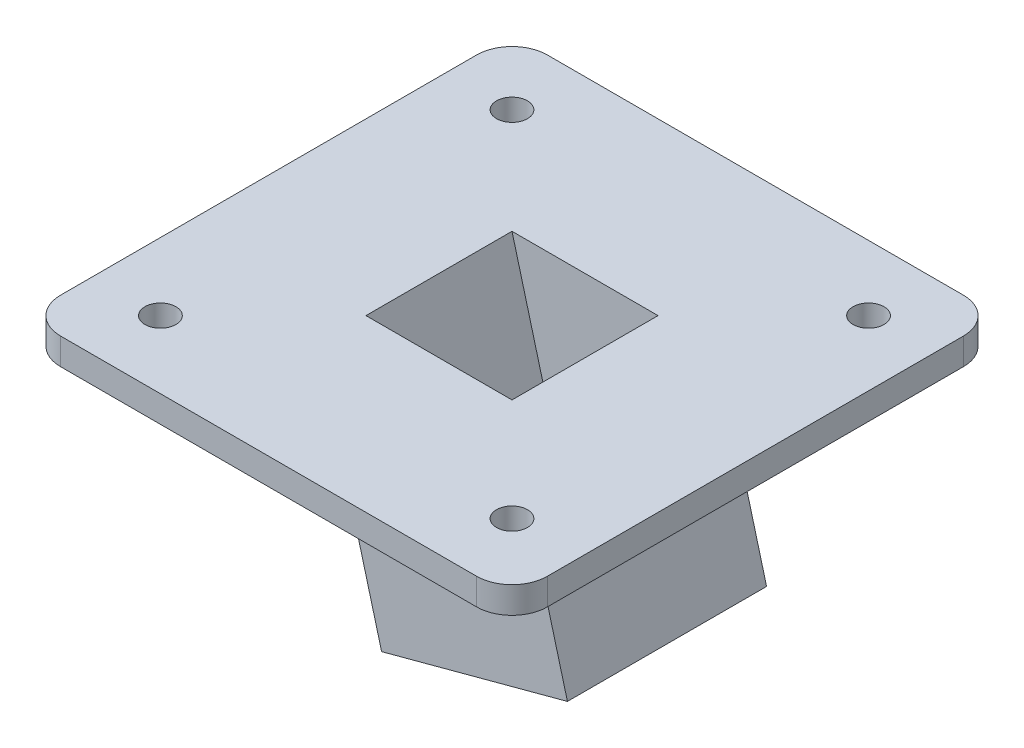
ISO-10303-21;
HEADER;
FILE_DESCRIPTION(('STEP AP214'),'2;1');
FILE_NAME('part.step','',(''),(''),'','','');
FILE_SCHEMA(('AUTOMOTIVE_DESIGN { 1 0 10303 214 1 1 1 1 }'));
ENDSEC;
DATA;
#1=APPLICATION_CONTEXT('core data for automotive mechanical design processes');
#2=APPLICATION_PROTOCOL_DEFINITION('international standard','automotive_design',2000,#1);
#3=PRODUCT_CONTEXT('',#1,'mechanical');
#4=PRODUCT('Part','Part','',(#3));
#5=PRODUCT_RELATED_PRODUCT_CATEGORY('part','',(#4));
#6=PRODUCT_DEFINITION_FORMATION('','',#4);
#7=PRODUCT_DEFINITION_CONTEXT('part definition',#1,'design');
#8=PRODUCT_DEFINITION('design','',#6,#7);
#9=PRODUCT_DEFINITION_SHAPE('','',#8);
#10=(LENGTH_UNIT() NAMED_UNIT(*) SI_UNIT(.MILLI.,.METRE.));
#11=(NAMED_UNIT(*) PLANE_ANGLE_UNIT() SI_UNIT($,.RADIAN.));
#12=(NAMED_UNIT(*) SI_UNIT($,.STERADIAN.) SOLID_ANGLE_UNIT());
#13=UNCERTAINTY_MEASURE_WITH_UNIT(LENGTH_MEASURE(1.E-05),#10,'distance_accuracy_value','');
#14=(GEOMETRIC_REPRESENTATION_CONTEXT(3) GLOBAL_UNCERTAINTY_ASSIGNED_CONTEXT((#13)) GLOBAL_UNIT_ASSIGNED_CONTEXT((#10,
#11,#12)) REPRESENTATION_CONTEXT('',''));
#15=CARTESIAN_POINT('',(0.,0.,0.));
#16=DIRECTION('',(0.,0.,1.));
#17=DIRECTION('',(1.,0.,0.));
#18=AXIS2_PLACEMENT_3D('',#15,#16,#17);
#19=CARTESIAN_POINT('',(0.,3.,0.));
#20=DIRECTION('',(0.,1.,0.));
#21=DIRECTION('',(0.,0.,1.));
#22=AXIS2_PLACEMENT_3D('',#19,#20,#21);
#23=PLANE('',#22);
#24=DIRECTION('',(-1.,0.,0.));
#25=VECTOR('',#24,1.);
#26=CARTESIAN_POINT('',(0.,3.,-8.25));
#27=LINE('',#26,#25);
#28=CARTESIAN_POINT('',(8.25,3.,-8.25));
#29=VERTEX_POINT('',#28);
#30=CARTESIAN_POINT('',(-8.24999999999999,3.,-8.25));
#31=VERTEX_POINT('',#30);
#32=EDGE_CURVE('E180',#29,#31,#27,.T.);
#33=ORIENTED_EDGE('',*,*,#32,.F.);
#34=DIRECTION('',(0.,0.,-1.));
#35=VECTOR('',#34,1.);
#36=CARTESIAN_POINT('',(8.25,3.,0.));
#37=LINE('',#36,#35);
#38=CARTESIAN_POINT('',(8.25,3.,8.25));
#39=VERTEX_POINT('',#38);
#40=EDGE_CURVE('E191',#39,#29,#37,.T.);
#41=ORIENTED_EDGE('',*,*,#40,.F.);
#42=DIRECTION('',(1.,0.,0.));
#43=VECTOR('',#42,1.);
#44=CARTESIAN_POINT('',(0.,3.,8.25));
#45=LINE('',#44,#43);
#46=CARTESIAN_POINT('',(-8.24999999999999,3.,8.25));
#47=VERTEX_POINT('',#46);
#48=EDGE_CURVE('E197',#47,#39,#45,.T.);
#49=ORIENTED_EDGE('',*,*,#48,.F.);
#50=DIRECTION('',(0.,0.,1.));
#51=VECTOR('',#50,1.);
#52=CARTESIAN_POINT('',(-8.24999999999999,3.,0.));
#53=LINE('',#52,#51);
#54=EDGE_CURVE('E201',#31,#47,#53,.T.);
#55=ORIENTED_EDGE('',*,*,#54,.F.);
#56=EDGE_LOOP('',(#33,#41,#49,#55));
#57=FACE_BOUND('',#56,.T.);
#58=CARTESIAN_POINT('',(-20.1403685268631,3.,-20.1403685268631));
#59=DIRECTION('',(0.,1.,0.));
#60=DIRECTION('',(0.,0.,-1.));
#61=AXIS2_PLACEMENT_3D('',#58,#59,#60);
#62=CIRCLE('',#61,1.75);
#63=CARTESIAN_POINT('',(-20.1403685268631,3.,-21.8903685268631));
#64=VERTEX_POINT('',#63);
#65=EDGE_CURVE('E249',#64,#64,#62,.T.);
#66=ORIENTED_EDGE('',*,*,#65,.F.);
#67=EDGE_LOOP('',(#66));
#68=FACE_BOUND('',#67,.T.);
#69=CARTESIAN_POINT('',(20.1403685268631,3.,-20.1403685268631));
#70=DIRECTION('',(0.,1.,0.));
#71=DIRECTION('',(0.,0.,1.));
#72=AXIS2_PLACEMENT_3D('',#69,#70,#71);
#73=CIRCLE('',#72,1.75);
#74=CARTESIAN_POINT('',(20.1403685268631,3.,-18.3903685268631));
#75=VERTEX_POINT('',#74);
#76=EDGE_CURVE('E261',#75,#75,#73,.T.);
#77=ORIENTED_EDGE('',*,*,#76,.F.);
#78=EDGE_LOOP('',(#77));
#79=FACE_BOUND('',#78,.T.);
#80=DIRECTION('',(1.,0.,0.));
#81=VECTOR('',#80,1.);
#82=CARTESIAN_POINT('',(-27.5,3.,27.5));
#83=LINE('',#82,#81);
#84=CARTESIAN_POINT('',(-23.5,3.,27.5));
#85=VERTEX_POINT('',#84);
#86=CARTESIAN_POINT('',(23.5,3.,27.5));
#87=VERTEX_POINT('',#86);
#88=EDGE_CURVE('E277',#85,#87,#83,.T.);
#89=ORIENTED_EDGE('',*,*,#88,.T.);
#90=CARTESIAN_POINT('',(23.5,3.,23.5));
#91=DIRECTION('',(0.,1.,0.));
#92=DIRECTION('',(0.,0.,1.));
#93=AXIS2_PLACEMENT_3D('',#90,#91,#92);
#94=CIRCLE('',#93,4.);
#95=CARTESIAN_POINT('',(27.5,3.,23.5));
#96=VERTEX_POINT('',#95);
#97=EDGE_CURVE('E323',#87,#96,#94,.T.);
#98=ORIENTED_EDGE('',*,*,#97,.T.);
#99=DIRECTION('',(0.,0.,-1.));
#100=VECTOR('',#99,1.);
#101=CARTESIAN_POINT('',(27.5,3.,-27.5));
#102=LINE('',#101,#100);
#103=CARTESIAN_POINT('',(27.5,3.,-23.5));
#104=VERTEX_POINT('',#103);
#105=EDGE_CURVE('E267',#96,#104,#102,.T.);
#106=ORIENTED_EDGE('',*,*,#105,.T.);
#107=CARTESIAN_POINT('',(23.5,3.,-23.5));
#108=DIRECTION('',(0.,1.,0.));
#109=DIRECTION('',(0.,0.,1.));
#110=AXIS2_PLACEMENT_3D('',#107,#108,#109);
#111=CIRCLE('',#110,4.);
#112=CARTESIAN_POINT('',(23.5,3.,-27.5));
#113=VERTEX_POINT('',#112);
#114=EDGE_CURVE('E321',#104,#113,#111,.T.);
#115=ORIENTED_EDGE('',*,*,#114,.T.);
#116=DIRECTION('',(-1.,0.,0.));
#117=VECTOR('',#116,1.);
#118=CARTESIAN_POINT('',(-27.5,3.,-27.5));
#119=LINE('',#118,#117);
#120=CARTESIAN_POINT('',(-23.5,3.,-27.5));
#121=VERTEX_POINT('',#120);
#122=EDGE_CURVE('E270',#113,#121,#119,.T.);
#123=ORIENTED_EDGE('',*,*,#122,.T.);
#124=CARTESIAN_POINT('',(-23.5,3.,-23.5));
#125=DIRECTION('',(0.,1.,0.));
#126=DIRECTION('',(0.,0.,1.));
#127=AXIS2_PLACEMENT_3D('',#124,#125,#126);
#128=CIRCLE('',#127,4.);
#129=CARTESIAN_POINT('',(-27.5,3.,-23.5));
#130=VERTEX_POINT('',#129);
#131=EDGE_CURVE('E319',#121,#130,#128,.T.);
#132=ORIENTED_EDGE('',*,*,#131,.T.);
#133=DIRECTION('',(0.,0.,1.));
#134=VECTOR('',#133,1.);
#135=CARTESIAN_POINT('',(-27.5,3.,-27.5));
#136=LINE('',#135,#134);
#137=CARTESIAN_POINT('',(-27.5,3.,23.5));
#138=VERTEX_POINT('',#137);
#139=EDGE_CURVE('E274',#130,#138,#136,.T.);
#140=ORIENTED_EDGE('',*,*,#139,.T.);
#141=CARTESIAN_POINT('',(-23.5,3.,23.5));
#142=DIRECTION('',(0.,1.,0.));
#143=DIRECTION('',(0.,0.,1.));
#144=AXIS2_PLACEMENT_3D('',#141,#142,#143);
#145=CIRCLE('',#144,4.);
#146=EDGE_CURVE('E317',#138,#85,#145,.T.);
#147=ORIENTED_EDGE('',*,*,#146,.T.);
#148=EDGE_LOOP('',(#89,#98,#106,#115,#123,#132,#140,#147));
#149=FACE_BOUND('',#148,.T.);
#150=CARTESIAN_POINT('',(-19.8596314731369,3.,19.8596314731369));
#151=DIRECTION('',(0.,1.,0.));
#152=DIRECTION('',(0.,0.,1.));
#153=AXIS2_PLACEMENT_3D('',#150,#151,#152);
#154=CIRCLE('',#153,1.75);
#155=CARTESIAN_POINT('',(-19.8596314731369,3.,21.6096314731369));
#156=VERTEX_POINT('',#155);
#157=EDGE_CURVE('E255',#156,#156,#154,.T.);
#158=ORIENTED_EDGE('',*,*,#157,.F.);
#159=EDGE_LOOP('',(#158));
#160=FACE_BOUND('',#159,.T.);
#161=CARTESIAN_POINT('',(19.8596314731369,3.,19.8596314731369));
#162=DIRECTION('',(0.,1.,0.));
#163=DIRECTION('',(0.,0.,-1.));
#164=AXIS2_PLACEMENT_3D('',#161,#162,#163);
#165=CIRCLE('',#164,1.75);
#166=CARTESIAN_POINT('',(19.8596314731369,3.,18.1096314731369));
#167=VERTEX_POINT('',#166);
#168=EDGE_CURVE('E243',#167,#167,#165,.T.);
#169=ORIENTED_EDGE('',*,*,#168,.F.);
#170=EDGE_LOOP('',(#169));
#171=FACE_BOUND('',#170,.T.);
#172=ADVANCED_FACE('F35',(#57,#68,#79,#149,#160,#171),#23,.T.);
#173=CARTESIAN_POINT('',(0.,0.,0.));
#174=DIRECTION('',(0.,1.,0.));
#175=DIRECTION('',(0.,0.,1.));
#176=AXIS2_PLACEMENT_3D('',#173,#174,#175);
#177=PLANE('',#176);
#178=DIRECTION('',(0.,0.,-1.));
#179=VECTOR('',#178,1.);
#180=CARTESIAN_POINT('',(17.2667490686582,0.,0.));
#181=LINE('',#180,#179);
#182=CARTESIAN_POINT('',(17.2667490686582,0.,15.25));
#183=VERTEX_POINT('',#182);
#184=CARTESIAN_POINT('',(17.2667490686582,0.,-15.25));
#185=VERTEX_POINT('',#184);
#186=EDGE_CURVE('E299',#183,#185,#181,.T.);
#187=ORIENTED_EDGE('',*,*,#186,.T.);
#188=DIRECTION('',(-1.,0.,0.));
#189=VECTOR('',#188,1.);
#190=CARTESIAN_POINT('',(0.,0.,-15.25));
#191=LINE('',#190,#189);
#192=CARTESIAN_POINT('',(-13.5154603746225,0.,-15.25));
#193=VERTEX_POINT('',#192);
#194=EDGE_CURVE('E301',#185,#193,#191,.T.);
#195=ORIENTED_EDGE('',*,*,#194,.T.);
#196=DIRECTION('',(0.,0.,1.));
#197=VECTOR('',#196,1.);
#198=CARTESIAN_POINT('',(-13.5154603746225,0.,0.));
#199=LINE('',#198,#197);
#200=CARTESIAN_POINT('',(-13.5154603746225,0.,15.25));
#201=VERTEX_POINT('',#200);
#202=EDGE_CURVE('E295',#193,#201,#199,.T.);
#203=ORIENTED_EDGE('',*,*,#202,.T.);
#204=DIRECTION('',(1.,0.,0.));
#205=VECTOR('',#204,1.);
#206=CARTESIAN_POINT('',(0.,0.,15.25));
#207=LINE('',#206,#205);
#208=EDGE_CURVE('E297',#201,#183,#207,.T.);
#209=ORIENTED_EDGE('',*,*,#208,.T.);
#210=EDGE_LOOP('',(#187,#195,#203,#209));
#211=FACE_BOUND('',#210,.T.);
#212=DIRECTION('',(0.,0.,-1.));
#213=VECTOR('',#212,1.);
#214=CARTESIAN_POINT('',(27.5,0.,-27.5));
#215=LINE('',#214,#213);
#216=CARTESIAN_POINT('',(27.5,0.,23.5));
#217=VERTEX_POINT('',#216);
#218=CARTESIAN_POINT('',(27.5,0.,-23.5));
#219=VERTEX_POINT('',#218);
#220=EDGE_CURVE('E264',#217,#219,#215,.T.);
#221=ORIENTED_EDGE('',*,*,#220,.F.);
#222=CARTESIAN_POINT('',(23.5,0.,23.5));
#223=DIRECTION('',(0.,1.,0.));
#224=DIRECTION('',(0.,0.,1.));
#225=AXIS2_PLACEMENT_3D('',#222,#223,#224);
#226=CIRCLE('',#225,4.);
#227=CARTESIAN_POINT('',(23.5,0.,27.5));
#228=VERTEX_POINT('',#227);
#229=EDGE_CURVE('E310',#217,#228,#226,.F.);
#230=ORIENTED_EDGE('',*,*,#229,.T.);
#231=DIRECTION('',(1.,0.,0.));
#232=VECTOR('',#231,1.);
#233=CARTESIAN_POINT('',(-27.5,0.,27.5));
#234=LINE('',#233,#232);
#235=CARTESIAN_POINT('',(-23.5,0.,27.5));
#236=VERTEX_POINT('',#235);
#237=EDGE_CURVE('E271',#236,#228,#234,.T.);
#238=ORIENTED_EDGE('',*,*,#237,.F.);
#239=CARTESIAN_POINT('',(-23.5,0.,23.5));
#240=DIRECTION('',(0.,1.,0.));
#241=DIRECTION('',(0.,0.,1.));
#242=AXIS2_PLACEMENT_3D('',#239,#240,#241);
#243=CIRCLE('',#242,4.);
#244=CARTESIAN_POINT('',(-27.5,0.,23.5));
#245=VERTEX_POINT('',#244);
#246=EDGE_CURVE('E304',#236,#245,#243,.F.);
#247=ORIENTED_EDGE('',*,*,#246,.T.);
#248=DIRECTION('',(0.,0.,1.));
#249=VECTOR('',#248,1.);
#250=CARTESIAN_POINT('',(-27.5,0.,-27.5));
#251=LINE('',#250,#249);
#252=CARTESIAN_POINT('',(-27.5,0.,-23.5));
#253=VERTEX_POINT('',#252);
#254=EDGE_CURVE('E286',#253,#245,#251,.T.);
#255=ORIENTED_EDGE('',*,*,#254,.F.);
#256=CARTESIAN_POINT('',(-23.5,0.,-23.5));
#257=DIRECTION('',(0.,1.,0.));
#258=DIRECTION('',(0.,0.,1.));
#259=AXIS2_PLACEMENT_3D('',#256,#257,#258);
#260=CIRCLE('',#259,4.);
#261=CARTESIAN_POINT('',(-23.5,0.,-27.5));
#262=VERTEX_POINT('',#261);
#263=EDGE_CURVE('E306',#253,#262,#260,.F.);
#264=ORIENTED_EDGE('',*,*,#263,.T.);
#265=DIRECTION('',(-1.,0.,0.));
#266=VECTOR('',#265,1.);
#267=CARTESIAN_POINT('',(-27.5,0.,-27.5));
#268=LINE('',#267,#266);
#269=CARTESIAN_POINT('',(23.5,0.,-27.5));
#270=VERTEX_POINT('',#269);
#271=EDGE_CURVE('E283',#270,#262,#268,.T.);
#272=ORIENTED_EDGE('',*,*,#271,.F.);
#273=CARTESIAN_POINT('',(23.5,0.,-23.5));
#274=DIRECTION('',(0.,1.,0.));
#275=DIRECTION('',(0.,0.,1.));
#276=AXIS2_PLACEMENT_3D('',#273,#274,#275);
#277=CIRCLE('',#276,4.);
#278=EDGE_CURVE('E308',#270,#219,#277,.F.);
#279=ORIENTED_EDGE('',*,*,#278,.T.);
#280=EDGE_LOOP('',(#221,#230,#238,#247,#255,#264,#272,#279));
#281=FACE_BOUND('',#280,.T.);
#282=CARTESIAN_POINT('',(20.1403685268631,0.,-20.1403685268631));
#283=DIRECTION('',(0.,1.,0.));
#284=DIRECTION('',(0.,0.,1.));
#285=AXIS2_PLACEMENT_3D('',#282,#283,#284);
#286=CIRCLE('',#285,1.75);
#287=CARTESIAN_POINT('',(20.1403685268631,0.,-18.3903685268631));
#288=VERTEX_POINT('',#287);
#289=EDGE_CURVE('E258',#288,#288,#286,.T.);
#290=ORIENTED_EDGE('',*,*,#289,.T.);
#291=EDGE_LOOP('',(#290));
#292=FACE_BOUND('',#291,.T.);
#293=CARTESIAN_POINT('',(-19.8596314731369,0.,19.8596314731369));
#294=DIRECTION('',(0.,1.,0.));
#295=DIRECTION('',(0.,0.,1.));
#296=AXIS2_PLACEMENT_3D('',#293,#294,#295);
#297=CIRCLE('',#296,1.75);
#298=CARTESIAN_POINT('',(-19.8596314731369,0.,21.6096314731369));
#299=VERTEX_POINT('',#298);
#300=EDGE_CURVE('E252',#299,#299,#297,.T.);
#301=ORIENTED_EDGE('',*,*,#300,.T.);
#302=EDGE_LOOP('',(#301));
#303=FACE_BOUND('',#302,.T.);
#304=CARTESIAN_POINT('',(-20.1403685268631,0.,-20.1403685268631));
#305=DIRECTION('',(0.,1.,0.));
#306=DIRECTION('',(0.,0.,-1.));
#307=AXIS2_PLACEMENT_3D('',#304,#305,#306);
#308=CIRCLE('',#307,1.75);
#309=CARTESIAN_POINT('',(-20.1403685268631,0.,-21.8903685268631));
#310=VERTEX_POINT('',#309);
#311=EDGE_CURVE('E246',#310,#310,#308,.T.);
#312=ORIENTED_EDGE('',*,*,#311,.T.);
#313=EDGE_LOOP('',(#312));
#314=FACE_BOUND('',#313,.T.);
#315=CARTESIAN_POINT('',(19.8596314731369,0.,19.8596314731369));
#316=DIRECTION('',(0.,1.,0.));
#317=DIRECTION('',(0.,0.,-1.));
#318=AXIS2_PLACEMENT_3D('',#315,#316,#317);
#319=CIRCLE('',#318,1.75);
#320=CARTESIAN_POINT('',(19.8596314731369,0.,18.1096314731369));
#321=VERTEX_POINT('',#320);
#322=EDGE_CURVE('E234',#321,#321,#319,.T.);
#323=ORIENTED_EDGE('',*,*,#322,.T.);
#324=EDGE_LOOP('',(#323));
#325=FACE_BOUND('',#324,.T.);
#326=ADVANCED_FACE('F362',(#211,#281,#292,#303,#314,#325),#177,.F.);
#327=CARTESIAN_POINT('',(27.5,3.,-27.5));
#328=DIRECTION('',(-1.,0.,0.));
#329=DIRECTION('',(0.,0.,1.));
#330=AXIS2_PLACEMENT_3D('',#327,#328,#329);
#331=PLANE('',#330);
#332=ORIENTED_EDGE('',*,*,#105,.F.);
#333=DIRECTION('',(0.,-1.,0.));
#334=VECTOR('',#333,1.);
#335=CARTESIAN_POINT('',(27.5,3.,23.5));
#336=LINE('',#335,#334);
#337=EDGE_CURVE('E292',#96,#217,#336,.T.);
#338=ORIENTED_EDGE('',*,*,#337,.T.);
#339=ORIENTED_EDGE('',*,*,#220,.T.);
#340=DIRECTION('',(0.,-1.,0.));
#341=VECTOR('',#340,1.);
#342=CARTESIAN_POINT('',(27.5,3.,-23.5));
#343=LINE('',#342,#341);
#344=EDGE_CURVE('E280',#219,#104,#343,.F.);
#345=ORIENTED_EDGE('',*,*,#344,.T.);
#346=EDGE_LOOP('',(#332,#338,#339,#345));
#347=FACE_BOUND('',#346,.T.);
#348=ADVANCED_FACE('F401',(#347),#331,.F.);
#349=CARTESIAN_POINT('',(-27.5,3.,-27.5));
#350=DIRECTION('',(0.,0.,1.));
#351=DIRECTION('',(1.,0.,0.));
#352=AXIS2_PLACEMENT_3D('',#349,#350,#351);
#353=PLANE('',#352);
#354=ORIENTED_EDGE('',*,*,#122,.F.);
#355=DIRECTION('',(0.,-1.,0.));
#356=VECTOR('',#355,1.);
#357=CARTESIAN_POINT('',(23.5,3.,-27.5));
#358=LINE('',#357,#356);
#359=EDGE_CURVE('E327',#113,#270,#358,.T.);
#360=ORIENTED_EDGE('',*,*,#359,.T.);
#361=ORIENTED_EDGE('',*,*,#271,.T.);
#362=DIRECTION('',(0.,-1.,0.));
#363=VECTOR('',#362,1.);
#364=CARTESIAN_POINT('',(-23.5,3.,-27.5));
#365=LINE('',#364,#363);
#366=EDGE_CURVE('E325',#262,#121,#365,.F.);
#367=ORIENTED_EDGE('',*,*,#366,.T.);
#368=EDGE_LOOP('',(#354,#360,#361,#367));
#369=FACE_BOUND('',#368,.T.);
#370=ADVANCED_FACE('F414',(#369),#353,.F.);
#371=CARTESIAN_POINT('',(-27.5,3.,-27.5));
#372=DIRECTION('',(1.,0.,0.));
#373=DIRECTION('',(0.,0.,-1.));
#374=AXIS2_PLACEMENT_3D('',#371,#372,#373);
#375=PLANE('',#374);
#376=ORIENTED_EDGE('',*,*,#139,.F.);
#377=DIRECTION('',(0.,-1.,0.));
#378=VECTOR('',#377,1.);
#379=CARTESIAN_POINT('',(-27.5,3.,-23.5));
#380=LINE('',#379,#378);
#381=EDGE_CURVE('E332',#130,#253,#380,.T.);
#382=ORIENTED_EDGE('',*,*,#381,.T.);
#383=ORIENTED_EDGE('',*,*,#254,.T.);
#384=DIRECTION('',(0.,-1.,0.));
#385=VECTOR('',#384,1.);
#386=CARTESIAN_POINT('',(-27.5,3.,23.5));
#387=LINE('',#386,#385);
#388=EDGE_CURVE('E330',#245,#138,#387,.F.);
#389=ORIENTED_EDGE('',*,*,#388,.T.);
#390=EDGE_LOOP('',(#376,#382,#383,#389));
#391=FACE_BOUND('',#390,.T.);
#392=ADVANCED_FACE('F410',(#391),#375,.F.);
#393=CARTESIAN_POINT('',(-27.5,3.,27.5));
#394=DIRECTION('',(0.,0.,-1.));
#395=DIRECTION('',(-1.,0.,0.));
#396=AXIS2_PLACEMENT_3D('',#393,#394,#395);
#397=PLANE('',#396);
#398=ORIENTED_EDGE('',*,*,#237,.T.);
#399=DIRECTION('',(0.,-1.,0.));
#400=VECTOR('',#399,1.);
#401=CARTESIAN_POINT('',(23.5,3.,27.5));
#402=LINE('',#401,#400);
#403=EDGE_CURVE('E315',#228,#87,#402,.F.);
#404=ORIENTED_EDGE('',*,*,#403,.T.);
#405=ORIENTED_EDGE('',*,*,#88,.F.);
#406=DIRECTION('',(0.,-1.,0.));
#407=VECTOR('',#406,1.);
#408=CARTESIAN_POINT('',(-23.5,3.,27.5));
#409=LINE('',#408,#407);
#410=EDGE_CURVE('E312',#85,#236,#409,.T.);
#411=ORIENTED_EDGE('',*,*,#410,.T.);
#412=EDGE_LOOP('',(#398,#404,#405,#411));
#413=FACE_BOUND('',#412,.T.);
#414=ADVANCED_FACE('F407',(#413),#397,.F.);
#415=CARTESIAN_POINT('',(20.1403685268631,3.,-20.1403685268631));
#416=DIRECTION('',(0.,-1.,0.));
#417=DIRECTION('',(0.,0.,-1.));
#418=AXIS2_PLACEMENT_3D('',#415,#416,#417);
#419=CYLINDRICAL_SURFACE('',#418,1.75);
#420=ORIENTED_EDGE('',*,*,#76,.T.);
#421=EDGE_LOOP('',(#420));
#422=FACE_BOUND('',#421,.T.);
#423=ORIENTED_EDGE('',*,*,#289,.F.);
#424=EDGE_LOOP('',(#423));
#425=FACE_BOUND('',#424,.T.);
#426=ADVANCED_FACE('F404',(#422,#425),#419,.F.);
#427=CARTESIAN_POINT('',(-19.8596314731369,3.,19.8596314731369));
#428=DIRECTION('',(0.,-1.,0.));
#429=DIRECTION('',(0.,0.,-1.));
#430=AXIS2_PLACEMENT_3D('',#427,#428,#429);
#431=CYLINDRICAL_SURFACE('',#430,1.75);
#432=ORIENTED_EDGE('',*,*,#157,.T.);
#433=EDGE_LOOP('',(#432));
#434=FACE_BOUND('',#433,.T.);
#435=ORIENTED_EDGE('',*,*,#300,.F.);
#436=EDGE_LOOP('',(#435));
#437=FACE_BOUND('',#436,.T.);
#438=ADVANCED_FACE('F534',(#434,#437),#431,.F.);
#439=CARTESIAN_POINT('',(-20.1403685268631,3.,-20.1403685268631));
#440=DIRECTION('',(0.,-1.,0.));
#441=DIRECTION('',(0.,0.,-1.));
#442=AXIS2_PLACEMENT_3D('',#439,#440,#441);
#443=CYLINDRICAL_SURFACE('',#442,1.75);
#444=ORIENTED_EDGE('',*,*,#65,.T.);
#445=EDGE_LOOP('',(#444));
#446=FACE_BOUND('',#445,.T.);
#447=ORIENTED_EDGE('',*,*,#311,.F.);
#448=EDGE_LOOP('',(#447));
#449=FACE_BOUND('',#448,.T.);
#450=ADVANCED_FACE('F527',(#446,#449),#443,.F.);
#451=CARTESIAN_POINT('',(19.8596314731369,3.,19.8596314731369));
#452=DIRECTION('',(0.,-1.,0.));
#453=DIRECTION('',(0.,0.,-1.));
#454=AXIS2_PLACEMENT_3D('',#451,#452,#453);
#455=CYLINDRICAL_SURFACE('',#454,1.75);
#456=ORIENTED_EDGE('',*,*,#168,.T.);
#457=EDGE_LOOP('',(#456));
#458=FACE_BOUND('',#457,.T.);
#459=ORIENTED_EDGE('',*,*,#322,.F.);
#460=EDGE_LOOP('',(#459));
#461=FACE_BOUND('',#460,.T.);
#462=ADVANCED_FACE('F392',(#458,#461),#455,.F.);
#463=CARTESIAN_POINT('',(17.5119196223968,-20.3698021836972,11.25));
#464=DIRECTION('',(0.965925826289068,0.258819045102522,0.));
#465=DIRECTION('',(-0.258819045102522,0.965925826289068,0.));
#466=AXIS2_PLACEMENT_3D('',#463,#464,#465);
#467=PLANE('',#466);
#468=DIRECTION('',(-0.258819045102522,0.965925826289068,0.));
#469=VECTOR('',#468,1.);
#470=CARTESIAN_POINT('',(17.5119196223968,-20.3698021836972,-11.25));
#471=LINE('',#470,#469);
#472=CARTESIAN_POINT('',(17.5119196223968,-20.3698021836972,-11.25));
#473=VERTEX_POINT('',#472);
#474=CARTESIAN_POINT('',(13.4030457635019,-5.03527618041008,-11.25));
#475=VERTEX_POINT('',#474);
#476=EDGE_CURVE('E230',#473,#475,#471,.T.);
#477=ORIENTED_EDGE('',*,*,#476,.T.);
#478=DIRECTION('',(0.,0.,-1.));
#479=VECTOR('',#478,1.);
#480=CARTESIAN_POINT('',(13.4030457635019,-5.03527618041009,11.25));
#481=LINE('',#480,#479);
#482=CARTESIAN_POINT('',(13.4030457635019,-5.03527618041008,11.25));
#483=VERTEX_POINT('',#482);
#484=EDGE_CURVE('E337',#475,#483,#481,.F.);
#485=ORIENTED_EDGE('',*,*,#484,.T.);
#486=DIRECTION('',(-0.258819045102522,0.965925826289068,0.));
#487=VECTOR('',#486,1.);
#488=CARTESIAN_POINT('',(17.5119196223968,-20.3698021836972,11.25));
#489=LINE('',#488,#487);
#490=CARTESIAN_POINT('',(17.5119196223968,-20.3698021836972,11.25));
#491=VERTEX_POINT('',#490);
#492=EDGE_CURVE('E231',#491,#483,#489,.T.);
#493=ORIENTED_EDGE('',*,*,#492,.F.);
#494=DIRECTION('',(0.,0.,-1.));
#495=VECTOR('',#494,1.);
#496=CARTESIAN_POINT('',(17.5119196223968,-20.3698021836972,11.25));
#497=LINE('',#496,#495);
#498=EDGE_CURVE('E215',#491,#473,#497,.T.);
#499=ORIENTED_EDGE('',*,*,#498,.T.);
#500=EDGE_LOOP('',(#477,#485,#493,#499));
#501=FACE_BOUND('',#500,.T.);
#502=ADVANCED_FACE('F382',(#501),#467,.T.);
#503=CARTESIAN_POINT('',(-3.48086617017814,-25.9948021836972,11.25));
#504=DIRECTION('',(0.,0.,1.));
#505=DIRECTION('',(1.,0.,0.));
#506=AXIS2_PLACEMENT_3D('',#503,#504,#505);
#507=PLANE('',#506);
#508=CARTESIAN_POINT('',(17.2667490686582,-4.,11.25));
#509=DIRECTION('',(0.,0.,1.));
#510=DIRECTION('',(1.,0.,0.));
#511=AXIS2_PLACEMENT_3D('',#508,#509,#510);
#512=CIRCLE('',#511,4.);
#513=CARTESIAN_POINT('',(13.2667490686582,-4.,11.25));
#514=VERTEX_POINT('',#513);
#515=EDGE_CURVE('E44',#483,#514,#512,.F.);
#516=ORIENTED_EDGE('',*,*,#515,.T.);
#517=DIRECTION('',(1.,0.,0.));
#518=VECTOR('',#517,1.);
#519=CARTESIAN_POINT('',(-3.48086617017814,-4.,11.25));
#520=LINE('',#519,#518);
#521=CARTESIAN_POINT('',(-9.37435565298213,-4.,11.25));
#522=VERTEX_POINT('',#521);
#523=EDGE_CURVE('E59',#514,#522,#520,.F.);
#524=ORIENTED_EDGE('',*,*,#523,.T.);
#525=DIRECTION('',(-0.258819045102522,0.965925826289068,0.));
#526=VECTOR('',#525,1.);
#527=CARTESIAN_POINT('',(-3.48086617017814,-25.9948021836972,11.25));
#528=LINE('',#527,#526);
#529=CARTESIAN_POINT('',(-3.48086617017814,-25.9948021836972,11.25));
#530=VERTEX_POINT('',#529);
#531=EDGE_CURVE('E235',#530,#522,#528,.T.);
#532=ORIENTED_EDGE('',*,*,#531,.F.);
#533=DIRECTION('',(0.965925826289068,0.258819045102522,0.));
#534=VECTOR('',#533,1.);
#535=CARTESIAN_POINT('',(-3.48086617017814,-25.9948021836972,11.25));
#536=LINE('',#535,#534);
#537=EDGE_CURVE('E227',#530,#491,#536,.T.);
#538=ORIENTED_EDGE('',*,*,#537,.T.);
#539=ORIENTED_EDGE('',*,*,#492,.T.);
#540=EDGE_LOOP('',(#516,#524,#532,#538,#539));
#541=FACE_BOUND('',#540,.T.);
#542=ADVANCED_FACE('F384',(#541),#507,.T.);
#543=CARTESIAN_POINT('',(-3.48086617017814,-25.9948021836972,-11.25));
#544=DIRECTION('',(-0.965925826289068,-0.258819045102522,0.));
#545=DIRECTION('',(0.258819045102522,-0.965925826289068,0.));
#546=AXIS2_PLACEMENT_3D('',#543,#544,#545);
#547=PLANE('',#546);
#548=CARTESIAN_POINT('',(-9.37435565298213,-4.,15.25));
#549=DIRECTION('',(-0.965925826289068,-0.258819045102522,0.));
#550=DIRECTION('',(0.258819045102522,-0.965925826289068,0.));
#551=AXIS2_PLACEMENT_3D('',#548,#549,#550);
#552=ELLIPSE('',#551,4.14110472164033,4.);
#553=CARTESIAN_POINT('',(-9.65175706946619,-2.96472381958991,11.3862966948437));
#554=VERTEX_POINT('',#553);
#555=EDGE_CURVE('E11',#522,#554,#552,.F.);
#556=ORIENTED_EDGE('',*,*,#555,.T.);
#557=DIRECTION('',(0.,0.,1.));
#558=VECTOR('',#557,1.);
#559=CARTESIAN_POINT('',(-9.65175706946619,-2.96472381958992,-11.25));
#560=LINE('',#559,#558);
#561=CARTESIAN_POINT('',(-9.65175706946619,-2.96472381958991,-11.3862966948437));
#562=VERTEX_POINT('',#561);
#563=EDGE_CURVE('E52',#554,#562,#560,.F.);
#564=ORIENTED_EDGE('',*,*,#563,.T.);
#565=CARTESIAN_POINT('',(-9.37435565298213,-4.,-15.25));
#566=DIRECTION('',(-0.965925826289068,-0.258819045102522,0.));
#567=DIRECTION('',(-0.258819045102522,0.965925826289068,0.));
#568=AXIS2_PLACEMENT_3D('',#565,#566,#567);
#569=ELLIPSE('',#568,4.14110472164033,4.);
#570=CARTESIAN_POINT('',(-9.37435565298213,-4.,-11.25));
#571=VERTEX_POINT('',#570);
#572=EDGE_CURVE('E341',#562,#571,#569,.F.);
#573=ORIENTED_EDGE('',*,*,#572,.T.);
#574=DIRECTION('',(-0.258819045102522,0.965925826289068,0.));
#575=VECTOR('',#574,1.);
#576=CARTESIAN_POINT('',(-3.48086617017814,-25.9948021836972,-11.25));
#577=LINE('',#576,#575);
#578=CARTESIAN_POINT('',(-3.48086617017814,-25.9948021836972,-11.25));
#579=VERTEX_POINT('',#578);
#580=EDGE_CURVE('E238',#579,#571,#577,.T.);
#581=ORIENTED_EDGE('',*,*,#580,.F.);
#582=DIRECTION('',(0.,0.,1.));
#583=VECTOR('',#582,1.);
#584=CARTESIAN_POINT('',(-3.48086617017814,-25.9948021836972,-11.25));
#585=LINE('',#584,#583);
#586=EDGE_CURVE('E224',#579,#530,#585,.T.);
#587=ORIENTED_EDGE('',*,*,#586,.T.);
#588=ORIENTED_EDGE('',*,*,#531,.T.);
#589=EDGE_LOOP('',(#556,#564,#573,#581,#587,#588));
#590=FACE_BOUND('',#589,.T.);
#591=ADVANCED_FACE('F371',(#590),#547,.T.);
#592=CARTESIAN_POINT('',(17.5119196223968,-20.3698021836972,-11.25));
#593=DIRECTION('',(0.,0.,-1.));
#594=DIRECTION('',(-1.,0.,0.));
#595=AXIS2_PLACEMENT_3D('',#592,#593,#594);
#596=PLANE('',#595);
#597=ORIENTED_EDGE('',*,*,#580,.T.);
#598=DIRECTION('',(-1.,0.,0.));
#599=VECTOR('',#598,1.);
#600=CARTESIAN_POINT('',(17.5119196223968,-4.,-11.25));
#601=LINE('',#600,#599);
#602=CARTESIAN_POINT('',(13.2667490686582,-4.,-11.25));
#603=VERTEX_POINT('',#602);
#604=EDGE_CURVE('E335',#571,#603,#601,.F.);
#605=ORIENTED_EDGE('',*,*,#604,.T.);
#606=CARTESIAN_POINT('',(17.2667490686582,-4.,-11.25));
#607=DIRECTION('',(0.,0.,-1.));
#608=DIRECTION('',(-1.,0.,0.));
#609=AXIS2_PLACEMENT_3D('',#606,#607,#608);
#610=CIRCLE('',#609,4.);
#611=EDGE_CURVE('E343',#603,#475,#610,.F.);
#612=ORIENTED_EDGE('',*,*,#611,.T.);
#613=ORIENTED_EDGE('',*,*,#476,.F.);
#614=DIRECTION('',(-0.965925826289068,-0.258819045102522,0.));
#615=VECTOR('',#614,1.);
#616=CARTESIAN_POINT('',(17.5119196223968,-20.3698021836972,-11.25));
#617=LINE('',#616,#615);
#618=EDGE_CURVE('E221',#473,#579,#617,.T.);
#619=ORIENTED_EDGE('',*,*,#618,.T.);
#620=EDGE_LOOP('',(#597,#605,#612,#613,#619));
#621=FACE_BOUND('',#620,.T.);
#622=ADVANCED_FACE('F374',(#621),#596,.T.);
#623=CARTESIAN_POINT('',(6.26552672610931,-23.3832640780205,0.));
#624=DIRECTION('',(-0.258819045102522,0.965925826289068,0.));
#625=DIRECTION('',(-0.965925826289068,-0.258819045102522,0.));
#626=AXIS2_PLACEMENT_3D('',#623,#624,#625);
#627=PLANE('',#626);
#628=DIRECTION('',(0.965925826289068,0.258819045102522,0.));
#629=VECTOR('',#628,1.);
#630=CARTESIAN_POINT('',(-0.681828064501486,-25.2448021836972,8.25));
#631=LINE('',#630,#629);
#632=CARTESIAN_POINT('',(-0.681828064501486,-25.2448021836972,8.25));
#633=VERTEX_POINT('',#632);
#634=CARTESIAN_POINT('',(14.7128815167201,-21.1198021836972,8.25));
#635=VERTEX_POINT('',#634);
#636=EDGE_CURVE('E188',#633,#635,#631,.T.);
#637=ORIENTED_EDGE('',*,*,#636,.T.);
#638=DIRECTION('',(0.,0.,-1.));
#639=VECTOR('',#638,1.);
#640=CARTESIAN_POINT('',(14.7128815167201,-21.1198021836972,8.25));
#641=LINE('',#640,#639);
#642=CARTESIAN_POINT('',(14.7128815167201,-21.1198021836972,-8.25));
#643=VERTEX_POINT('',#642);
#644=EDGE_CURVE('E202',#635,#643,#641,.T.);
#645=ORIENTED_EDGE('',*,*,#644,.T.);
#646=DIRECTION('',(-0.965925826289068,-0.258819045102522,0.));
#647=VECTOR('',#646,1.);
#648=CARTESIAN_POINT('',(14.7128815167201,-21.1198021836972,-8.25));
#649=LINE('',#648,#647);
#650=CARTESIAN_POINT('',(-0.681828064501492,-25.2448021836972,-8.25));
#651=VERTEX_POINT('',#650);
#652=EDGE_CURVE('E183',#643,#651,#649,.T.);
#653=ORIENTED_EDGE('',*,*,#652,.T.);
#654=DIRECTION('',(0.,0.,1.));
#655=VECTOR('',#654,1.);
#656=CARTESIAN_POINT('',(-0.681828064501486,-25.2448021836972,-8.25));
#657=LINE('',#656,#655);
#658=EDGE_CURVE('E209',#651,#633,#657,.T.);
#659=ORIENTED_EDGE('',*,*,#658,.T.);
#660=EDGE_LOOP('',(#637,#645,#653,#659));
#661=FACE_BOUND('',#660,.T.);
#662=ORIENTED_EDGE('',*,*,#498,.F.);
#663=ORIENTED_EDGE('',*,*,#537,.F.);
#664=ORIENTED_EDGE('',*,*,#586,.F.);
#665=ORIENTED_EDGE('',*,*,#618,.F.);
#666=EDGE_LOOP('',(#662,#663,#664,#665));
#667=FACE_BOUND('',#666,.T.);
#668=ADVANCED_FACE('F379',(#661,#667),#627,.F.);
#669=CARTESIAN_POINT('',(14.7128815167201,-21.1198021836972,8.25));
#670=DIRECTION('',(0.965925826289068,0.258819045102522,0.));
#671=DIRECTION('',(-0.258819045102522,0.965925826289068,0.));
#672=AXIS2_PLACEMENT_3D('',#669,#670,#671);
#673=PLANE('',#672);
#674=DIRECTION('',(-0.258819045102522,0.965925826289068,0.));
#675=VECTOR('',#674,1.);
#676=CARTESIAN_POINT('',(14.7128815167201,-21.1198021836972,8.25));
#677=LINE('',#676,#675);
#678=EDGE_CURVE('E193',#635,#39,#677,.T.);
#679=ORIENTED_EDGE('',*,*,#678,.T.);
#680=ORIENTED_EDGE('',*,*,#40,.T.);
#681=DIRECTION('',(-0.258819045102522,0.965925826289068,0.));
#682=VECTOR('',#681,1.);
#683=CARTESIAN_POINT('',(14.7128815167201,-21.1198021836972,-8.25));
#684=LINE('',#683,#682);
#685=EDGE_CURVE('E175',#643,#29,#684,.T.);
#686=ORIENTED_EDGE('',*,*,#685,.F.);
#687=ORIENTED_EDGE('',*,*,#644,.F.);
#688=EDGE_LOOP('',(#679,#680,#686,#687));
#689=FACE_BOUND('',#688,.T.);
#690=ADVANCED_FACE('F192',(#689),#673,.F.);
#691=CARTESIAN_POINT('',(-0.681828064501486,-25.2448021836972,8.25));
#692=DIRECTION('',(0.,0.,1.));
#693=DIRECTION('',(1.,0.,0.));
#694=AXIS2_PLACEMENT_3D('',#691,#692,#693);
#695=PLANE('',#694);
#696=DIRECTION('',(-0.258819045102522,0.965925826289068,0.));
#697=VECTOR('',#696,1.);
#698=CARTESIAN_POINT('',(-0.681828064501486,-25.2448021836972,8.25));
#699=LINE('',#698,#697);
#700=EDGE_CURVE('E216',#633,#47,#699,.T.);
#701=ORIENTED_EDGE('',*,*,#700,.T.);
#702=ORIENTED_EDGE('',*,*,#48,.T.);
#703=ORIENTED_EDGE('',*,*,#678,.F.);
#704=ORIENTED_EDGE('',*,*,#636,.F.);
#705=EDGE_LOOP('',(#701,#702,#703,#704));
#706=FACE_BOUND('',#705,.T.);
#707=ADVANCED_FACE('F476',(#706),#695,.F.);
#708=CARTESIAN_POINT('',(-0.681828064501486,-25.2448021836972,-8.25));
#709=DIRECTION('',(-0.965925826289068,-0.258819045102522,0.));
#710=DIRECTION('',(0.258819045102522,-0.965925826289068,0.));
#711=AXIS2_PLACEMENT_3D('',#708,#709,#710);
#712=PLANE('',#711);
#713=DIRECTION('',(-0.258819045102522,0.965925826289068,0.));
#714=VECTOR('',#713,1.);
#715=CARTESIAN_POINT('',(-0.681828064501486,-25.2448021836972,-8.25));
#716=LINE('',#715,#714);
#717=EDGE_CURVE('E187',#651,#31,#716,.T.);
#718=ORIENTED_EDGE('',*,*,#717,.T.);
#719=ORIENTED_EDGE('',*,*,#54,.T.);
#720=ORIENTED_EDGE('',*,*,#700,.F.);
#721=ORIENTED_EDGE('',*,*,#658,.F.);
#722=EDGE_LOOP('',(#718,#719,#720,#721));
#723=FACE_BOUND('',#722,.T.);
#724=ADVANCED_FACE('F469',(#723),#712,.F.);
#725=CARTESIAN_POINT('',(14.7128815167201,-21.1198021836972,-8.25));
#726=DIRECTION('',(0.,0.,-1.));
#727=DIRECTION('',(-1.,0.,0.));
#728=AXIS2_PLACEMENT_3D('',#725,#726,#727);
#729=PLANE('',#728);
#730=ORIENTED_EDGE('',*,*,#685,.T.);
#731=ORIENTED_EDGE('',*,*,#32,.T.);
#732=ORIENTED_EDGE('',*,*,#717,.F.);
#733=ORIENTED_EDGE('',*,*,#652,.F.);
#734=EDGE_LOOP('',(#730,#731,#732,#733));
#735=FACE_BOUND('',#734,.T.);
#736=ADVANCED_FACE('F177',(#735),#729,.F.);
#737=CARTESIAN_POINT('',(23.5,3.,23.5));
#738=DIRECTION('',(0.,-1.,0.));
#739=DIRECTION('',(0.,0.,-1.));
#740=AXIS2_PLACEMENT_3D('',#737,#738,#739);
#741=CYLINDRICAL_SURFACE('',#740,4.);
#742=ORIENTED_EDGE('',*,*,#97,.F.);
#743=ORIENTED_EDGE('',*,*,#403,.F.);
#744=ORIENTED_EDGE('',*,*,#229,.F.);
#745=ORIENTED_EDGE('',*,*,#337,.F.);
#746=EDGE_LOOP('',(#742,#743,#744,#745));
#747=FACE_BOUND('',#746,.T.);
#748=ADVANCED_FACE('F422',(#747),#741,.T.);
#749=CARTESIAN_POINT('',(23.5,3.,-23.5));
#750=DIRECTION('',(0.,-1.,0.));
#751=DIRECTION('',(0.,0.,-1.));
#752=AXIS2_PLACEMENT_3D('',#749,#750,#751);
#753=CYLINDRICAL_SURFACE('',#752,4.);
#754=ORIENTED_EDGE('',*,*,#114,.F.);
#755=ORIENTED_EDGE('',*,*,#344,.F.);
#756=ORIENTED_EDGE('',*,*,#278,.F.);
#757=ORIENTED_EDGE('',*,*,#359,.F.);
#758=EDGE_LOOP('',(#754,#755,#756,#757));
#759=FACE_BOUND('',#758,.T.);
#760=ADVANCED_FACE('F425',(#759),#753,.T.);
#761=CARTESIAN_POINT('',(-23.5,3.,-23.5));
#762=DIRECTION('',(0.,-1.,0.));
#763=DIRECTION('',(0.,0.,-1.));
#764=AXIS2_PLACEMENT_3D('',#761,#762,#763);
#765=CYLINDRICAL_SURFACE('',#764,4.);
#766=ORIENTED_EDGE('',*,*,#131,.F.);
#767=ORIENTED_EDGE('',*,*,#366,.F.);
#768=ORIENTED_EDGE('',*,*,#263,.F.);
#769=ORIENTED_EDGE('',*,*,#381,.F.);
#770=EDGE_LOOP('',(#766,#767,#768,#769));
#771=FACE_BOUND('',#770,.T.);
#772=ADVANCED_FACE('F429',(#771),#765,.T.);
#773=CARTESIAN_POINT('',(-23.5,3.,23.5));
#774=DIRECTION('',(0.,-1.,0.));
#775=DIRECTION('',(0.,0.,-1.));
#776=AXIS2_PLACEMENT_3D('',#773,#774,#775);
#777=CYLINDRICAL_SURFACE('',#776,4.);
#778=ORIENTED_EDGE('',*,*,#146,.F.);
#779=ORIENTED_EDGE('',*,*,#388,.F.);
#780=ORIENTED_EDGE('',*,*,#246,.F.);
#781=ORIENTED_EDGE('',*,*,#410,.F.);
#782=EDGE_LOOP('',(#778,#779,#780,#781));
#783=FACE_BOUND('',#782,.T.);
#784=ADVANCED_FACE('F433',(#783),#777,.T.);
#785=CARTESIAN_POINT('',(0.,-4.,15.25));
#786=DIRECTION('',(1.,0.,0.));
#787=DIRECTION('',(0.,0.,-1.));
#788=AXIS2_PLACEMENT_3D('',#785,#786,#787);
#789=CYLINDRICAL_SURFACE('',#788,4.);
#790=ORIENTED_EDGE('',*,*,#523,.F.);
#791=CARTESIAN_POINT('',(17.2667490686582,-4.,15.25));
#792=DIRECTION('',(0.707106781186547,0.,-0.707106781186548));
#793=DIRECTION('',(0.707106781186548,0.,0.707106781186547));
#794=AXIS2_PLACEMENT_3D('',#791,#792,#793);
#795=ELLIPSE('',#794,5.65685424949238,4.);
#796=EDGE_CURVE('E39',#183,#514,#795,.F.);
#797=ORIENTED_EDGE('',*,*,#796,.F.);
#798=ORIENTED_EDGE('',*,*,#208,.F.);
#799=CARTESIAN_POINT('',(-13.5154603746225,-4.,15.25));
#800=DIRECTION('',(0.707106781186548,0.,0.707106781186547));
#801=DIRECTION('',(-0.707106781186547,0.,0.707106781186548));
#802=AXIS2_PLACEMENT_3D('',#799,#800,#801);
#803=ELLIPSE('',#802,5.65685424949238,4.);
#804=EDGE_CURVE('E350',#554,#201,#803,.T.);
#805=ORIENTED_EDGE('',*,*,#804,.F.);
#806=ORIENTED_EDGE('',*,*,#555,.F.);
#807=EDGE_LOOP('',(#790,#797,#798,#805,#806));
#808=FACE_BOUND('',#807,.T.);
#809=ADVANCED_FACE('F37',(#808),#789,.F.);
#810=CARTESIAN_POINT('',(17.2667490686582,-4.,0.));
#811=DIRECTION('',(0.,0.,-1.));
#812=DIRECTION('',(-1.,0.,0.));
#813=AXIS2_PLACEMENT_3D('',#810,#811,#812);
#814=CYLINDRICAL_SURFACE('',#813,4.);
#815=ORIENTED_EDGE('',*,*,#484,.F.);
#816=ORIENTED_EDGE('',*,*,#611,.F.);
#817=CARTESIAN_POINT('',(17.2667490686582,-4.,-15.25));
#818=DIRECTION('',(-0.707106781186548,0.,-0.707106781186547));
#819=DIRECTION('',(0.707106781186547,0.,-0.707106781186548));
#820=AXIS2_PLACEMENT_3D('',#817,#818,#819);
#821=ELLIPSE('',#820,5.65685424949238,4.);
#822=EDGE_CURVE('E348',#185,#603,#821,.F.);
#823=ORIENTED_EDGE('',*,*,#822,.F.);
#824=ORIENTED_EDGE('',*,*,#186,.F.);
#825=ORIENTED_EDGE('',*,*,#796,.T.);
#826=ORIENTED_EDGE('',*,*,#515,.F.);
#827=EDGE_LOOP('',(#815,#816,#823,#824,#825,#826));
#828=FACE_BOUND('',#827,.T.);
#829=ADVANCED_FACE('F358',(#828),#814,.F.);
#830=CARTESIAN_POINT('',(-13.5154603746225,-4.,0.));
#831=DIRECTION('',(0.,0.,1.));
#832=DIRECTION('',(1.,0.,0.));
#833=AXIS2_PLACEMENT_3D('',#830,#831,#832);
#834=CYLINDRICAL_SURFACE('',#833,4.);
#835=ORIENTED_EDGE('',*,*,#804,.T.);
#836=ORIENTED_EDGE('',*,*,#202,.F.);
#837=CARTESIAN_POINT('',(-13.5154603746225,-4.,-15.25));
#838=DIRECTION('',(-0.707106781186547,0.,0.707106781186548));
#839=DIRECTION('',(0.707106781186548,0.,0.707106781186547));
#840=AXIS2_PLACEMENT_3D('',#837,#838,#839);
#841=ELLIPSE('',#840,5.65685424949238,4.);
#842=EDGE_CURVE('E346',#562,#193,#841,.T.);
#843=ORIENTED_EDGE('',*,*,#842,.F.);
#844=ORIENTED_EDGE('',*,*,#563,.F.);
#845=EDGE_LOOP('',(#835,#836,#843,#844));
#846=FACE_BOUND('',#845,.T.);
#847=ADVANCED_FACE('F365',(#846),#834,.F.);
#848=CARTESIAN_POINT('',(0.,-4.,-15.25));
#849=DIRECTION('',(-1.,0.,0.));
#850=DIRECTION('',(0.,0.,1.));
#851=AXIS2_PLACEMENT_3D('',#848,#849,#850);
#852=CYLINDRICAL_SURFACE('',#851,4.);
#853=ORIENTED_EDGE('',*,*,#822,.T.);
#854=ORIENTED_EDGE('',*,*,#604,.F.);
#855=ORIENTED_EDGE('',*,*,#572,.F.);
#856=ORIENTED_EDGE('',*,*,#842,.T.);
#857=ORIENTED_EDGE('',*,*,#194,.F.);
#858=EDGE_LOOP('',(#853,#854,#855,#856,#857));
#859=FACE_BOUND('',#858,.T.);
#860=ADVANCED_FACE('F369',(#859),#852,.F.);
#861=CLOSED_SHELL('',(#172,#326,#348,#370,#392,#414,#426,#438,#450,#462,#502,#542,#591,#622,
#668,#690,#707,#724,#736,#748,#760,#772,#784,#809,#829,#847,#860));
#862=MANIFOLD_SOLID_BREP('B2',#861);
#863=ADVANCED_BREP_SHAPE_REPRESENTATION('',(#18,#862),#14);
#864=SHAPE_DEFINITION_REPRESENTATION(#9,#863);
ENDSEC;
END-ISO-10303-21;
